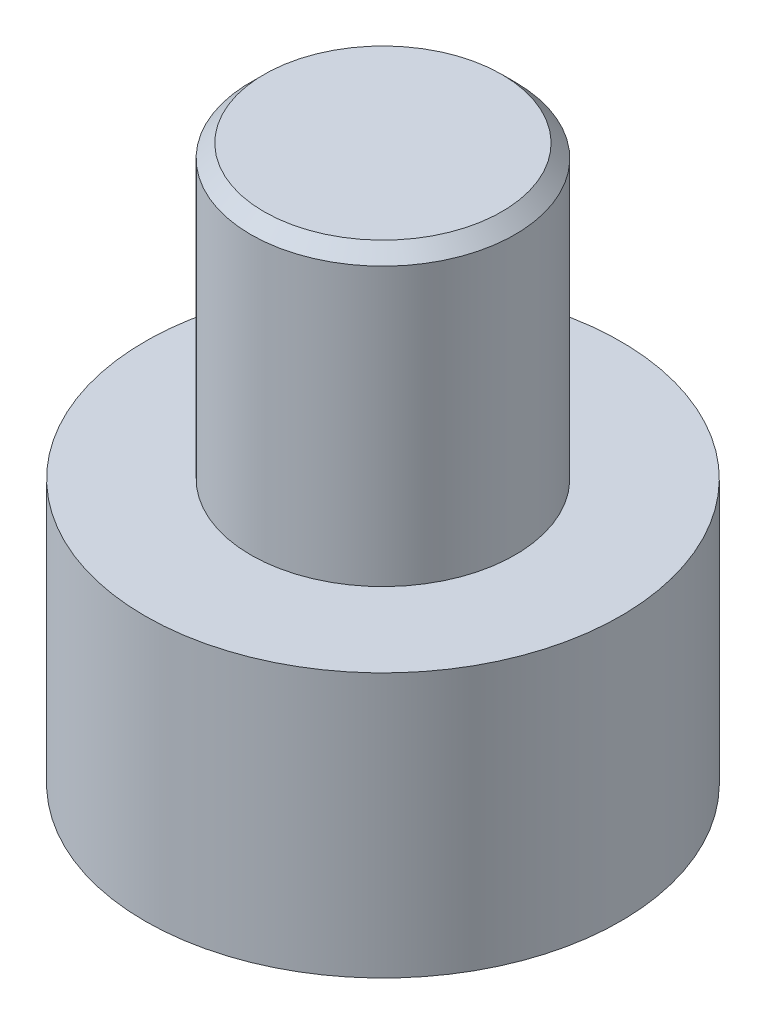
ISO-10303-21;
HEADER;
FILE_DESCRIPTION(('STEP AP214'),'2;1');
FILE_NAME('part.step','',(''),(''),'','','');
FILE_SCHEMA(('AUTOMOTIVE_DESIGN { 1 0 10303 214 1 1 1 1 }'));
ENDSEC;
DATA;
#1=APPLICATION_CONTEXT('core data for automotive mechanical design processes');
#2=APPLICATION_PROTOCOL_DEFINITION('international standard','automotive_design',2000,#1);
#3=PRODUCT_CONTEXT('',#1,'mechanical');
#4=PRODUCT('Part','Part','',(#3));
#5=PRODUCT_RELATED_PRODUCT_CATEGORY('part','',(#4));
#6=PRODUCT_DEFINITION_FORMATION('','',#4);
#7=PRODUCT_DEFINITION_CONTEXT('part definition',#1,'design');
#8=PRODUCT_DEFINITION('design','',#6,#7);
#9=PRODUCT_DEFINITION_SHAPE('','',#8);
#10=(LENGTH_UNIT() NAMED_UNIT(*) SI_UNIT(.MILLI.,.METRE.));
#11=(NAMED_UNIT(*) PLANE_ANGLE_UNIT() SI_UNIT($,.RADIAN.));
#12=(NAMED_UNIT(*) SI_UNIT($,.STERADIAN.) SOLID_ANGLE_UNIT());
#13=UNCERTAINTY_MEASURE_WITH_UNIT(LENGTH_MEASURE(1.E-05),#10,'distance_accuracy_value','');
#14=(GEOMETRIC_REPRESENTATION_CONTEXT(3) GLOBAL_UNCERTAINTY_ASSIGNED_CONTEXT((#13)) GLOBAL_UNIT_ASSIGNED_CONTEXT((#10,
#11,#12)) REPRESENTATION_CONTEXT('',''));
#15=CARTESIAN_POINT('',(0.,0.,0.));
#16=DIRECTION('',(0.,0.,1.));
#17=DIRECTION('',(1.,0.,0.));
#18=AXIS2_PLACEMENT_3D('',#15,#16,#17);
#19=CARTESIAN_POINT('',(0.,0.,0.));
#20=DIRECTION('',(0.,-1.,0.));
#21=DIRECTION('',(0.,0.,-1.));
#22=AXIS2_PLACEMENT_3D('',#19,#20,#21);
#23=PLANE('',#22);
#24=CARTESIAN_POINT('',(0.,0.,0.));
#25=DIRECTION('',(0.,1.,0.));
#26=DIRECTION('',(0.,0.,1.));
#27=AXIS2_PLACEMENT_3D('',#24,#25,#26);
#28=CIRCLE('',#27,9.);
#29=CARTESIAN_POINT('',(0.,0.,9.));
#30=VERTEX_POINT('',#29);
#31=EDGE_CURVE('E59',#30,#30,#28,.T.);
#32=ORIENTED_EDGE('',*,*,#31,.F.);
#33=EDGE_LOOP('',(#32));
#34=FACE_BOUND('',#33,.T.);
#35=ADVANCED_FACE('F43',(#34),#23,.T.);
#36=CARTESIAN_POINT('',(0.,21.,0.));
#37=DIRECTION('',(0.,1.,0.));
#38=DIRECTION('',(0.,0.,1.));
#39=AXIS2_PLACEMENT_3D('',#36,#37,#38);
#40=CYLINDRICAL_SURFACE('',#39,9.);
#41=ORIENTED_EDGE('',*,*,#31,.T.);
#42=EDGE_LOOP('',(#41));
#43=FACE_BOUND('',#42,.T.);
#44=CARTESIAN_POINT('',(0.,10.,0.));
#45=DIRECTION('',(0.,1.,0.));
#46=DIRECTION('',(0.,0.,1.));
#47=AXIS2_PLACEMENT_3D('',#44,#45,#46);
#48=CIRCLE('',#47,9.);
#49=CARTESIAN_POINT('',(0.,10.,9.));
#50=VERTEX_POINT('',#49);
#51=EDGE_CURVE('E64',#50,#50,#48,.T.);
#52=ORIENTED_EDGE('',*,*,#51,.F.);
#53=EDGE_LOOP('',(#52));
#54=FACE_BOUND('',#53,.T.);
#55=ADVANCED_FACE('F80',(#43,#54),#40,.T.);
#56=CARTESIAN_POINT('',(-9.,10.,0.));
#57=DIRECTION('',(0.,1.,0.));
#58=DIRECTION('',(0.,0.,1.));
#59=AXIS2_PLACEMENT_3D('',#56,#57,#58);
#60=PLANE('',#59);
#61=ORIENTED_EDGE('',*,*,#51,.T.);
#62=EDGE_LOOP('',(#61));
#63=FACE_BOUND('',#62,.T.);
#64=CARTESIAN_POINT('',(0.,10.,0.));
#65=DIRECTION('',(0.,1.,0.));
#66=DIRECTION('',(0.,0.,1.));
#67=AXIS2_PLACEMENT_3D('',#64,#65,#66);
#68=CIRCLE('',#67,5.);
#69=CARTESIAN_POINT('',(0.,10.,5.));
#70=VERTEX_POINT('',#69);
#71=EDGE_CURVE('E68',#70,#70,#68,.T.);
#72=ORIENTED_EDGE('',*,*,#71,.F.);
#73=EDGE_LOOP('',(#72));
#74=FACE_BOUND('',#73,.T.);
#75=ADVANCED_FACE('F73',(#63,#74),#60,.T.);
#76=CARTESIAN_POINT('',(0.,21.,0.));
#77=DIRECTION('',(0.,1.,0.));
#78=DIRECTION('',(0.,0.,1.));
#79=AXIS2_PLACEMENT_3D('',#76,#77,#78);
#80=CYLINDRICAL_SURFACE('',#79,5.);
#81=CARTESIAN_POINT('',(0.,20.5,0.));
#82=DIRECTION('',(0.,1.,0.));
#83=DIRECTION('',(0.,0.,1.));
#84=AXIS2_PLACEMENT_3D('',#81,#82,#83);
#85=CIRCLE('',#84,5.);
#86=CARTESIAN_POINT('',(0.,20.5,5.));
#87=VERTEX_POINT('',#86);
#88=EDGE_CURVE('E10',#87,#87,#85,.F.);
#89=ORIENTED_EDGE('',*,*,#88,.T.);
#90=EDGE_LOOP('',(#89));
#91=FACE_BOUND('',#90,.T.);
#92=ORIENTED_EDGE('',*,*,#71,.T.);
#93=EDGE_LOOP('',(#92));
#94=FACE_BOUND('',#93,.T.);
#95=ADVANCED_FACE('F71',(#91,#94),#80,.T.);
#96=CARTESIAN_POINT('',(-5.,21.,0.));
#97=DIRECTION('',(0.,1.,0.));
#98=DIRECTION('',(0.,0.,1.));
#99=AXIS2_PLACEMENT_3D('',#96,#97,#98);
#100=PLANE('',#99);
#101=CARTESIAN_POINT('',(0.,21.,0.));
#102=DIRECTION('',(0.,1.,0.));
#103=DIRECTION('',(0.,0.,1.));
#104=AXIS2_PLACEMENT_3D('',#101,#102,#103);
#105=CIRCLE('',#104,4.5);
#106=CARTESIAN_POINT('',(0.,21.,4.5));
#107=VERTEX_POINT('',#106);
#108=EDGE_CURVE('E55',#107,#107,#105,.T.);
#109=ORIENTED_EDGE('',*,*,#108,.T.);
#110=EDGE_LOOP('',(#109));
#111=FACE_BOUND('',#110,.T.);
#112=ADVANCED_FACE('F83',(#111),#100,.T.);
#113=CARTESIAN_POINT('',(0.,21.,0.));
#114=DIRECTION('',(0.,-1.,0.));
#115=DIRECTION('',(0.,0.,-1.));
#116=AXIS2_PLACEMENT_3D('',#113,#114,#115);
#117=CONICAL_SURFACE('',#116,4.5,0.78539816339745);
#118=ORIENTED_EDGE('',*,*,#88,.F.);
#119=EDGE_LOOP('',(#118));
#120=FACE_BOUND('',#119,.T.);
#121=ORIENTED_EDGE('',*,*,#108,.F.);
#122=EDGE_LOOP('',(#121));
#123=FACE_BOUND('',#122,.T.);
#124=ADVANCED_FACE('F46',(#120,#123),#117,.T.);
#125=CLOSED_SHELL('',(#35,#55,#75,#95,#112,#124));
#126=MANIFOLD_SOLID_BREP('B2',#125);
#127=ADVANCED_BREP_SHAPE_REPRESENTATION('',(#18,#126),#14);
#128=SHAPE_DEFINITION_REPRESENTATION(#9,#127);
ENDSEC;
END-ISO-10303-21;
